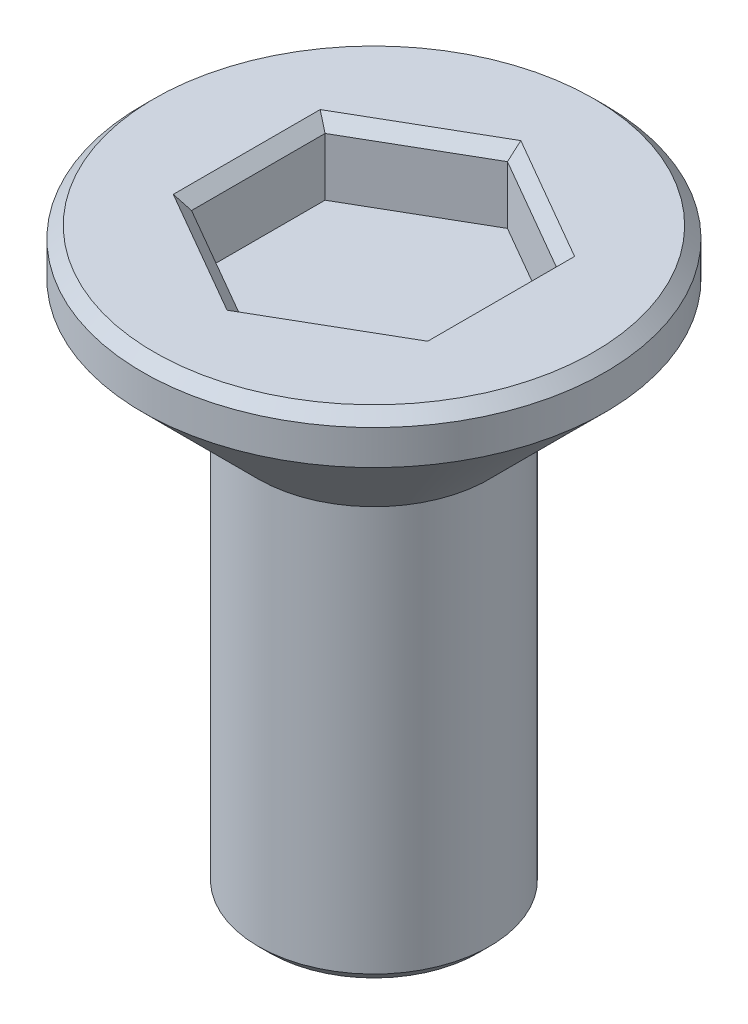
ISO-10303-21;
HEADER;
FILE_DESCRIPTION(('STEP AP214'),'2;1');
FILE_NAME('part.step','',(''),(''),'','','');
FILE_SCHEMA(('AUTOMOTIVE_DESIGN { 1 0 10303 214 1 1 1 1 }'));
ENDSEC;
DATA;
#1=APPLICATION_CONTEXT('core data for automotive mechanical design processes');
#2=APPLICATION_PROTOCOL_DEFINITION('international standard','automotive_design',2000,#1);
#3=PRODUCT_CONTEXT('',#1,'mechanical');
#4=PRODUCT('Part','Part','',(#3));
#5=PRODUCT_RELATED_PRODUCT_CATEGORY('part','',(#4));
#6=PRODUCT_DEFINITION_FORMATION('','',#4);
#7=PRODUCT_DEFINITION_CONTEXT('part definition',#1,'design');
#8=PRODUCT_DEFINITION('design','',#6,#7);
#9=PRODUCT_DEFINITION_SHAPE('','',#8);
#10=(LENGTH_UNIT() NAMED_UNIT(*) SI_UNIT(.MILLI.,.METRE.));
#11=(NAMED_UNIT(*) PLANE_ANGLE_UNIT() SI_UNIT($,.RADIAN.));
#12=(NAMED_UNIT(*) SI_UNIT($,.STERADIAN.) SOLID_ANGLE_UNIT());
#13=UNCERTAINTY_MEASURE_WITH_UNIT(LENGTH_MEASURE(1.E-05),#10,'distance_accuracy_value','');
#14=(GEOMETRIC_REPRESENTATION_CONTEXT(3) GLOBAL_UNCERTAINTY_ASSIGNED_CONTEXT((#13)) GLOBAL_UNIT_ASSIGNED_CONTEXT((#10,
#11,#12)) REPRESENTATION_CONTEXT('',''));
#15=CARTESIAN_POINT('',(0.,0.,0.));
#16=DIRECTION('',(0.,0.,1.));
#17=DIRECTION('',(1.,0.,0.));
#18=AXIS2_PLACEMENT_3D('',#15,#16,#17);
#19=CARTESIAN_POINT('',(0.,5.,0.));
#20=DIRECTION('',(0.,-1.,0.));
#21=DIRECTION('',(0.,0.,-1.));
#22=AXIS2_PLACEMENT_3D('',#19,#20,#21);
#23=PLANE('',#22);
#24=DIRECTION('',(-0.866025403784439,0.,0.5));
#25=VECTOR('',#24,1.);
#26=CARTESIAN_POINT('',(0.55,5.,0.952627944162882));
#27=LINE('',#26,#25);
#28=CARTESIAN_POINT('',(1.1,5.,0.635085296108588));
#29=VERTEX_POINT('',#28);
#30=CARTESIAN_POINT('',(0.,5.,1.27017059221718));
#31=VERTEX_POINT('',#30);
#32=EDGE_CURVE('E182',#29,#31,#27,.T.);
#33=ORIENTED_EDGE('',*,*,#32,.T.);
#34=DIRECTION('',(-0.866025403784439,0.,-0.5));
#35=VECTOR('',#34,1.);
#36=CARTESIAN_POINT('',(-0.55,5.,0.952627944162883));
#37=LINE('',#36,#35);
#38=CARTESIAN_POINT('',(-1.1,5.,0.635085296108589));
#39=VERTEX_POINT('',#38);
#40=EDGE_CURVE('E184',#31,#39,#37,.T.);
#41=ORIENTED_EDGE('',*,*,#40,.T.);
#42=DIRECTION('',(0.,0.,-1.));
#43=VECTOR('',#42,1.);
#44=CARTESIAN_POINT('',(-1.1,5.,0.));
#45=LINE('',#44,#43);
#46=CARTESIAN_POINT('',(-1.1,5.,-0.635085296108589));
#47=VERTEX_POINT('',#46);
#48=EDGE_CURVE('E174',#39,#47,#45,.T.);
#49=ORIENTED_EDGE('',*,*,#48,.T.);
#50=DIRECTION('',(0.866025403784439,0.,-0.5));
#51=VECTOR('',#50,1.);
#52=CARTESIAN_POINT('',(-0.55,5.,-0.952627944162883));
#53=LINE('',#52,#51);
#54=CARTESIAN_POINT('',(0.,5.,-1.27017059221718));
#55=VERTEX_POINT('',#54);
#56=EDGE_CURVE('E176',#47,#55,#53,.T.);
#57=ORIENTED_EDGE('',*,*,#56,.T.);
#58=DIRECTION('',(0.866025403784439,0.,0.5));
#59=VECTOR('',#58,1.);
#60=CARTESIAN_POINT('',(0.550000000000001,5.,-0.952627944162883));
#61=LINE('',#60,#59);
#62=CARTESIAN_POINT('',(1.1,5.,-0.635085296108589));
#63=VERTEX_POINT('',#62);
#64=EDGE_CURVE('E178',#55,#63,#61,.T.);
#65=ORIENTED_EDGE('',*,*,#64,.T.);
#66=DIRECTION('',(0.,0.,1.));
#67=VECTOR('',#66,1.);
#68=CARTESIAN_POINT('',(1.1,5.,0.));
#69=LINE('',#68,#67);
#70=EDGE_CURVE('E180',#63,#29,#69,.T.);
#71=ORIENTED_EDGE('',*,*,#70,.T.);
#72=EDGE_LOOP('',(#33,#41,#49,#57,#65,#71));
#73=FACE_BOUND('',#72,.T.);
#74=CARTESIAN_POINT('',(0.,5.,0.));
#75=DIRECTION('',(0.,-1.,0.));
#76=DIRECTION('',(0.,0.,-1.));
#77=AXIS2_PLACEMENT_3D('',#74,#75,#76);
#78=CIRCLE('',#77,1.9);
#79=CARTESIAN_POINT('',(0.,5.,-1.9));
#80=VERTEX_POINT('',#79);
#81=EDGE_CURVE('E171',#80,#80,#78,.F.);
#82=ORIENTED_EDGE('',*,*,#81,.T.);
#83=EDGE_LOOP('',(#82));
#84=FACE_BOUND('',#83,.T.);
#85=ADVANCED_FACE('F37',(#73,#84),#23,.F.);
#86=CARTESIAN_POINT('',(0.,0.,0.));
#87=DIRECTION('',(0.,-1.,0.));
#88=DIRECTION('',(0.,0.,-1.));
#89=AXIS2_PLACEMENT_3D('',#86,#87,#88);
#90=CYLINDRICAL_SURFACE('',#89,2.);
#91=CARTESIAN_POINT('',(0.,4.9,0.));
#92=DIRECTION('',(0.,-1.,0.));
#93=DIRECTION('',(0.,0.,-1.));
#94=AXIS2_PLACEMENT_3D('',#91,#92,#93);
#95=CIRCLE('',#94,2.);
#96=CARTESIAN_POINT('',(0.,4.9,-2.));
#97=VERTEX_POINT('',#96);
#98=EDGE_CURVE('E11',#97,#97,#95,.T.);
#99=ORIENTED_EDGE('',*,*,#98,.T.);
#100=EDGE_LOOP('',(#99));
#101=FACE_BOUND('',#100,.T.);
#102=CARTESIAN_POINT('',(0.,4.59999999999999,0.));
#103=DIRECTION('',(0.,-1.,0.));
#104=DIRECTION('',(0.,0.,-1.));
#105=AXIS2_PLACEMENT_3D('',#102,#103,#104);
#106=CIRCLE('',#105,2.);
#107=CARTESIAN_POINT('',(0.,4.59999999999999,-2.));
#108=VERTEX_POINT('',#107);
#109=EDGE_CURVE('E161',#108,#108,#106,.T.);
#110=ORIENTED_EDGE('',*,*,#109,.F.);
#111=EDGE_LOOP('',(#110));
#112=FACE_BOUND('',#111,.T.);
#113=ADVANCED_FACE('F240',(#101,#112),#90,.T.);
#114=CARTESIAN_POINT('',(0.,4.59999999999999,0.));
#115=DIRECTION('',(0.,1.,0.));
#116=DIRECTION('',(0.,0.,1.));
#117=AXIS2_PLACEMENT_3D('',#114,#115,#116);
#118=CONICAL_SURFACE('',#117,2.,0.785398163397454);
#119=CARTESIAN_POINT('',(0.,3.6,0.));
#120=DIRECTION('',(0.,-1.,0.));
#121=DIRECTION('',(0.,0.,-1.));
#122=AXIS2_PLACEMENT_3D('',#119,#120,#121);
#123=CIRCLE('',#122,1.);
#124=CARTESIAN_POINT('',(0.,3.6,-1.));
#125=VERTEX_POINT('',#124);
#126=EDGE_CURVE('E151',#125,#125,#123,.T.);
#127=ORIENTED_EDGE('',*,*,#126,.F.);
#128=EDGE_LOOP('',(#127));
#129=FACE_BOUND('',#128,.T.);
#130=ORIENTED_EDGE('',*,*,#109,.T.);
#131=EDGE_LOOP('',(#130));
#132=FACE_BOUND('',#131,.T.);
#133=ADVANCED_FACE('F247',(#129,#132),#118,.T.);
#134=CARTESIAN_POINT('',(0.,0.,0.));
#135=DIRECTION('',(0.,-1.,0.));
#136=DIRECTION('',(0.,0.,-1.));
#137=AXIS2_PLACEMENT_3D('',#134,#135,#136);
#138=CYLINDRICAL_SURFACE('',#137,1.);
#139=CARTESIAN_POINT('',(0.,0.100000000000002,0.));
#140=DIRECTION('',(0.,1.,0.));
#141=DIRECTION('',(0.,0.,1.));
#142=AXIS2_PLACEMENT_3D('',#139,#140,#141);
#143=CIRCLE('',#142,1.);
#144=CARTESIAN_POINT('',(0.,0.100000000000002,1.));
#145=VERTEX_POINT('',#144);
#146=EDGE_CURVE('E167',#145,#145,#143,.T.);
#147=ORIENTED_EDGE('',*,*,#146,.T.);
#148=EDGE_LOOP('',(#147));
#149=FACE_BOUND('',#148,.T.);
#150=ORIENTED_EDGE('',*,*,#126,.T.);
#151=EDGE_LOOP('',(#150));
#152=FACE_BOUND('',#151,.T.);
#153=ADVANCED_FACE('F392',(#149,#152),#138,.T.);
#154=CARTESIAN_POINT('',(0.,0.,1.));
#155=DIRECTION('',(0.,1.,0.));
#156=DIRECTION('',(0.,0.,1.));
#157=AXIS2_PLACEMENT_3D('',#154,#155,#156);
#158=PLANE('',#157);
#159=CARTESIAN_POINT('',(0.,0.,0.));
#160=DIRECTION('',(0.,1.,0.));
#161=DIRECTION('',(0.,0.,1.));
#162=AXIS2_PLACEMENT_3D('',#159,#160,#161);
#163=CIRCLE('',#162,0.899999999999999);
#164=CARTESIAN_POINT('',(0.,0.,0.899999999999999));
#165=VERTEX_POINT('',#164);
#166=EDGE_CURVE('E164',#165,#165,#163,.F.);
#167=ORIENTED_EDGE('',*,*,#166,.T.);
#168=EDGE_LOOP('',(#167));
#169=FACE_BOUND('',#168,.T.);
#170=ADVANCED_FACE('F385',(#169),#158,.F.);
#171=CARTESIAN_POINT('',(-1.,4.4,0.577350269189626));
#172=DIRECTION('',(-0.5,0.,0.866025403784439));
#173=DIRECTION('',(0.866025403784439,0.,0.5));
#174=AXIS2_PLACEMENT_3D('',#171,#172,#173);
#175=PLANE('',#174);
#176=DIRECTION('',(0.,1.,0.));
#177=VECTOR('',#176,1.);
#178=CARTESIAN_POINT('',(-1.,4.4,0.577350269189626));
#179=LINE('',#178,#177);
#180=CARTESIAN_POINT('',(-1.,4.4,0.577350269189626));
#181=VERTEX_POINT('',#180);
#182=CARTESIAN_POINT('',(-1.,4.9,0.577350269189626));
#183=VERTEX_POINT('',#182);
#184=EDGE_CURVE('E149',#181,#183,#179,.T.);
#185=ORIENTED_EDGE('',*,*,#184,.T.);
#186=DIRECTION('',(0.866025403784439,0.,0.5));
#187=VECTOR('',#186,1.);
#188=CARTESIAN_POINT('',(-1.,4.9,0.577350269189626));
#189=LINE('',#188,#187);
#190=CARTESIAN_POINT('',(0.,4.9,1.15470053837925));
#191=VERTEX_POINT('',#190);
#192=EDGE_CURVE('E121',#183,#191,#189,.T.);
#193=ORIENTED_EDGE('',*,*,#192,.T.);
#194=DIRECTION('',(0.,1.,0.));
#195=VECTOR('',#194,1.);
#196=CARTESIAN_POINT('',(0.,4.4,1.15470053837925));
#197=LINE('',#196,#195);
#198=CARTESIAN_POINT('',(0.,4.4,1.15470053837925));
#199=VERTEX_POINT('',#198);
#200=EDGE_CURVE('E113',#199,#191,#197,.T.);
#201=ORIENTED_EDGE('',*,*,#200,.F.);
#202=DIRECTION('',(0.866025403784438,0.,0.5));
#203=VECTOR('',#202,1.);
#204=CARTESIAN_POINT('',(-1.,4.4,0.577350269189626));
#205=LINE('',#204,#203);
#206=EDGE_CURVE('E118',#181,#199,#205,.T.);
#207=ORIENTED_EDGE('',*,*,#206,.F.);
#208=EDGE_LOOP('',(#185,#193,#201,#207));
#209=FACE_BOUND('',#208,.T.);
#210=ADVANCED_FACE('F116',(#209),#175,.F.);
#211=CARTESIAN_POINT('',(-1.,4.4,-0.577350269189626));
#212=DIRECTION('',(-1.,0.,0.));
#213=DIRECTION('',(0.,0.,1.));
#214=AXIS2_PLACEMENT_3D('',#211,#212,#213);
#215=PLANE('',#214);
#216=DIRECTION('',(0.,1.,0.));
#217=VECTOR('',#216,1.);
#218=CARTESIAN_POINT('',(-1.,4.4,-0.577350269189626));
#219=LINE('',#218,#217);
#220=CARTESIAN_POINT('',(-1.,4.4,-0.577350269189626));
#221=VERTEX_POINT('',#220);
#222=CARTESIAN_POINT('',(-1.,4.9,-0.577350269189626));
#223=VERTEX_POINT('',#222);
#224=EDGE_CURVE('E152',#221,#223,#219,.T.);
#225=ORIENTED_EDGE('',*,*,#224,.T.);
#226=DIRECTION('',(0.,0.,1.));
#227=VECTOR('',#226,1.);
#228=CARTESIAN_POINT('',(-1.,4.9,-0.577350269189626));
#229=LINE('',#228,#227);
#230=EDGE_CURVE('E47',#223,#183,#229,.T.);
#231=ORIENTED_EDGE('',*,*,#230,.T.);
#232=ORIENTED_EDGE('',*,*,#184,.F.);
#233=DIRECTION('',(0.,0.,1.));
#234=VECTOR('',#233,1.);
#235=CARTESIAN_POINT('',(-1.,4.4,-0.577350269189626));
#236=LINE('',#235,#234);
#237=EDGE_CURVE('E124',#221,#181,#236,.T.);
#238=ORIENTED_EDGE('',*,*,#237,.F.);
#239=EDGE_LOOP('',(#225,#231,#232,#238));
#240=FACE_BOUND('',#239,.T.);
#241=ADVANCED_FACE('F224',(#240),#215,.F.);
#242=CARTESIAN_POINT('',(0.,4.4,-1.15470053837925));
#243=DIRECTION('',(-0.5,0.,-0.866025403784438));
#244=DIRECTION('',(-0.866025403784438,0.,0.5));
#245=AXIS2_PLACEMENT_3D('',#242,#243,#244);
#246=PLANE('',#245);
#247=DIRECTION('',(0.,1.,0.));
#248=VECTOR('',#247,1.);
#249=CARTESIAN_POINT('',(0.,4.4,-1.15470053837925));
#250=LINE('',#249,#248);
#251=CARTESIAN_POINT('',(0.,4.4,-1.15470053837925));
#252=VERTEX_POINT('',#251);
#253=CARTESIAN_POINT('',(0.,4.9,-1.15470053837925));
#254=VERTEX_POINT('',#253);
#255=EDGE_CURVE('E154',#252,#254,#250,.T.);
#256=ORIENTED_EDGE('',*,*,#255,.T.);
#257=DIRECTION('',(-0.866025403784438,0.,0.5));
#258=VECTOR('',#257,1.);
#259=CARTESIAN_POINT('',(0.,4.9,-1.15470053837925));
#260=LINE('',#259,#258);
#261=EDGE_CURVE('E55',#254,#223,#260,.T.);
#262=ORIENTED_EDGE('',*,*,#261,.T.);
#263=ORIENTED_EDGE('',*,*,#224,.F.);
#264=DIRECTION('',(-0.866025403784439,0.,0.5));
#265=VECTOR('',#264,1.);
#266=CARTESIAN_POINT('',(0.,4.4,-1.15470053837925));
#267=LINE('',#266,#265);
#268=EDGE_CURVE('E146',#252,#221,#267,.T.);
#269=ORIENTED_EDGE('',*,*,#268,.F.);
#270=EDGE_LOOP('',(#256,#262,#263,#269));
#271=FACE_BOUND('',#270,.T.);
#272=ADVANCED_FACE('F226',(#271),#246,.F.);
#273=CARTESIAN_POINT('',(1.,4.4,-0.577350269189626));
#274=DIRECTION('',(0.5,0.,-0.866025403784439));
#275=DIRECTION('',(-0.866025403784439,0.,-0.5));
#276=AXIS2_PLACEMENT_3D('',#273,#274,#275);
#277=PLANE('',#276);
#278=DIRECTION('',(0.,1.,0.));
#279=VECTOR('',#278,1.);
#280=CARTESIAN_POINT('',(1.,4.4,-0.577350269189626));
#281=LINE('',#280,#279);
#282=CARTESIAN_POINT('',(1.,4.4,-0.577350269189626));
#283=VERTEX_POINT('',#282);
#284=CARTESIAN_POINT('',(1.,4.9,-0.577350269189626));
#285=VERTEX_POINT('',#284);
#286=EDGE_CURVE('E156',#283,#285,#281,.T.);
#287=ORIENTED_EDGE('',*,*,#286,.T.);
#288=DIRECTION('',(-0.866025403784439,0.,-0.5));
#289=VECTOR('',#288,1.);
#290=CARTESIAN_POINT('',(1.,4.9,-0.577350269189626));
#291=LINE('',#290,#289);
#292=EDGE_CURVE('E63',#285,#254,#291,.T.);
#293=ORIENTED_EDGE('',*,*,#292,.T.);
#294=ORIENTED_EDGE('',*,*,#255,.F.);
#295=DIRECTION('',(-0.866025403784438,0.,-0.5));
#296=VECTOR('',#295,1.);
#297=CARTESIAN_POINT('',(1.,4.4,-0.577350269189626));
#298=LINE('',#297,#296);
#299=EDGE_CURVE('E143',#283,#252,#298,.T.);
#300=ORIENTED_EDGE('',*,*,#299,.F.);
#301=EDGE_LOOP('',(#287,#293,#294,#300));
#302=FACE_BOUND('',#301,.T.);
#303=ADVANCED_FACE('F228',(#302),#277,.F.);
#304=CARTESIAN_POINT('',(1.,4.4,0.577350269189626));
#305=DIRECTION('',(1.,0.,0.));
#306=DIRECTION('',(0.,0.,-1.));
#307=AXIS2_PLACEMENT_3D('',#304,#305,#306);
#308=PLANE('',#307);
#309=DIRECTION('',(0.,1.,0.));
#310=VECTOR('',#309,1.);
#311=CARTESIAN_POINT('',(1.,4.4,0.577350269189626));
#312=LINE('',#311,#310);
#313=CARTESIAN_POINT('',(1.,4.4,0.577350269189626));
#314=VERTEX_POINT('',#313);
#315=CARTESIAN_POINT('',(1.,4.9,0.577350269189626));
#316=VERTEX_POINT('',#315);
#317=EDGE_CURVE('E123',#314,#316,#312,.T.);
#318=ORIENTED_EDGE('',*,*,#317,.T.);
#319=DIRECTION('',(0.,0.,-1.));
#320=VECTOR('',#319,1.);
#321=CARTESIAN_POINT('',(1.,4.9,0.577350269189626));
#322=LINE('',#321,#320);
#323=EDGE_CURVE('E189',#316,#285,#322,.T.);
#324=ORIENTED_EDGE('',*,*,#323,.T.);
#325=ORIENTED_EDGE('',*,*,#286,.F.);
#326=DIRECTION('',(0.,0.,-1.));
#327=VECTOR('',#326,1.);
#328=CARTESIAN_POINT('',(1.,4.4,0.577350269189626));
#329=LINE('',#328,#327);
#330=EDGE_CURVE('E133',#314,#283,#329,.T.);
#331=ORIENTED_EDGE('',*,*,#330,.F.);
#332=EDGE_LOOP('',(#318,#324,#325,#331));
#333=FACE_BOUND('',#332,.T.);
#334=ADVANCED_FACE('F230',(#333),#308,.F.);
#335=CARTESIAN_POINT('',(0.,4.4,1.15470053837925));
#336=DIRECTION('',(0.5,0.,0.866025403784438));
#337=DIRECTION('',(0.866025403784438,0.,-0.5));
#338=AXIS2_PLACEMENT_3D('',#335,#336,#337);
#339=PLANE('',#338);
#340=ORIENTED_EDGE('',*,*,#200,.T.);
#341=DIRECTION('',(0.866025403784438,0.,-0.5));
#342=VECTOR('',#341,1.);
#343=CARTESIAN_POINT('',(0.,4.9,1.15470053837925));
#344=LINE('',#343,#342);
#345=EDGE_CURVE('E187',#191,#316,#344,.T.);
#346=ORIENTED_EDGE('',*,*,#345,.T.);
#347=ORIENTED_EDGE('',*,*,#317,.F.);
#348=DIRECTION('',(0.866025403784439,0.,-0.5));
#349=VECTOR('',#348,1.);
#350=CARTESIAN_POINT('',(0.,4.4,1.15470053837925));
#351=LINE('',#350,#349);
#352=EDGE_CURVE('E127',#199,#314,#351,.T.);
#353=ORIENTED_EDGE('',*,*,#352,.F.);
#354=EDGE_LOOP('',(#340,#346,#347,#353));
#355=FACE_BOUND('',#354,.T.);
#356=ADVANCED_FACE('F128',(#355),#339,.F.);
#357=CARTESIAN_POINT('',(0.,4.4,0.));
#358=DIRECTION('',(0.,1.,0.));
#359=DIRECTION('',(0.,0.,1.));
#360=AXIS2_PLACEMENT_3D('',#357,#358,#359);
#361=PLANE('',#360);
#362=ORIENTED_EDGE('',*,*,#206,.T.);
#363=ORIENTED_EDGE('',*,*,#352,.T.);
#364=ORIENTED_EDGE('',*,*,#330,.T.);
#365=ORIENTED_EDGE('',*,*,#299,.T.);
#366=ORIENTED_EDGE('',*,*,#268,.T.);
#367=ORIENTED_EDGE('',*,*,#237,.T.);
#368=EDGE_LOOP('',(#362,#363,#364,#365,#366,#367));
#369=FACE_BOUND('',#368,.T.);
#370=ADVANCED_FACE('F135',(#369),#361,.T.);
#371=CARTESIAN_POINT('',(0.,0.,0.));
#372=DIRECTION('',(0.,1.,0.));
#373=DIRECTION('',(0.,0.,1.));
#374=AXIS2_PLACEMENT_3D('',#371,#372,#373);
#375=CONICAL_SURFACE('',#374,0.899999999999999,0.785398163397444);
#376=ORIENTED_EDGE('',*,*,#146,.F.);
#377=EDGE_LOOP('',(#376));
#378=FACE_BOUND('',#377,.T.);
#379=ORIENTED_EDGE('',*,*,#166,.F.);
#380=EDGE_LOOP('',(#379));
#381=FACE_BOUND('',#380,.T.);
#382=ADVANCED_FACE('F254',(#378,#381),#375,.T.);
#383=CARTESIAN_POINT('',(1.,4.9,-0.577350269189626));
#384=DIRECTION('',(0.353553390593275,-0.707106781186545,-0.612372435695797));
#385=DIRECTION('',(-0.866025403784439,0.,-0.5));
#386=AXIS2_PLACEMENT_3D('',#383,#384,#385);
#387=PLANE('',#386);
#388=DIRECTION('',(0.654653670707975,0.65465367070798,-0.377964473009226));
#389=VECTOR('',#388,1.);
#390=CARTESIAN_POINT('',(0.714285714285716,4.61428571428571,-0.412393049421162));
#391=LINE('',#390,#389);
#392=EDGE_CURVE('E140',#63,#285,#391,.F.);
#393=ORIENTED_EDGE('',*,*,#392,.F.);
#394=ORIENTED_EDGE('',*,*,#64,.F.);
#395=DIRECTION('',(0.,0.65465367070798,-0.755928946018452));
#396=VECTOR('',#395,1.);
#397=CARTESIAN_POINT('',(0.,4.61428571428571,-0.824786098842325));
#398=LINE('',#397,#396);
#399=EDGE_CURVE('E42',#254,#55,#398,.T.);
#400=ORIENTED_EDGE('',*,*,#399,.F.);
#401=ORIENTED_EDGE('',*,*,#292,.F.);
#402=EDGE_LOOP('',(#393,#394,#400,#401));
#403=FACE_BOUND('',#402,.T.);
#404=ADVANCED_FACE('F212',(#403),#387,.F.);
#405=CARTESIAN_POINT('',(0.,4.9,-1.15470053837925));
#406=DIRECTION('',(-0.353553390593275,-0.707106781186545,-0.612372435695797));
#407=DIRECTION('',(-0.866025403784438,0.,0.5));
#408=AXIS2_PLACEMENT_3D('',#405,#406,#407);
#409=PLANE('',#408);
#410=ORIENTED_EDGE('',*,*,#399,.T.);
#411=ORIENTED_EDGE('',*,*,#56,.F.);
#412=DIRECTION('',(-0.654653670707974,0.65465367070798,-0.377964473009226));
#413=VECTOR('',#412,1.);
#414=CARTESIAN_POINT('',(-0.714285714285717,4.61428571428571,-0.412393049421162));
#415=LINE('',#414,#413);
#416=EDGE_CURVE('E201',#223,#47,#415,.T.);
#417=ORIENTED_EDGE('',*,*,#416,.F.);
#418=ORIENTED_EDGE('',*,*,#261,.F.);
#419=EDGE_LOOP('',(#410,#411,#417,#418));
#420=FACE_BOUND('',#419,.T.);
#421=ADVANCED_FACE('F217',(#420),#409,.F.);
#422=CARTESIAN_POINT('',(1.,4.9,0.577350269189626));
#423=DIRECTION('',(0.707106781186551,-0.707106781186544,0.));
#424=DIRECTION('',(0.,0.,-1.));
#425=AXIS2_PLACEMENT_3D('',#422,#423,#424);
#426=PLANE('',#425);
#427=ORIENTED_EDGE('',*,*,#392,.T.);
#428=ORIENTED_EDGE('',*,*,#323,.F.);
#429=DIRECTION('',(0.654653670707975,0.65465367070798,0.377964473009226));
#430=VECTOR('',#429,1.);
#431=CARTESIAN_POINT('',(0.714285714285716,4.61428571428571,0.412393049421162));
#432=LINE('',#431,#430);
#433=EDGE_CURVE('E198',#29,#316,#432,.F.);
#434=ORIENTED_EDGE('',*,*,#433,.F.);
#435=ORIENTED_EDGE('',*,*,#70,.F.);
#436=EDGE_LOOP('',(#427,#428,#434,#435));
#437=FACE_BOUND('',#436,.T.);
#438=ADVANCED_FACE('F208',(#437),#426,.F.);
#439=CARTESIAN_POINT('',(-1.,4.9,-0.577350269189626));
#440=DIRECTION('',(-0.707106781186551,-0.707106781186544,0.));
#441=DIRECTION('',(0.,0.,1.));
#442=AXIS2_PLACEMENT_3D('',#439,#440,#441);
#443=PLANE('',#442);
#444=ORIENTED_EDGE('',*,*,#416,.T.);
#445=ORIENTED_EDGE('',*,*,#48,.F.);
#446=DIRECTION('',(0.654653670707975,-0.654653670707981,-0.377964473009225));
#447=VECTOR('',#446,1.);
#448=CARTESIAN_POINT('',(-1.,4.9,0.577350269189626));
#449=LINE('',#448,#447);
#450=EDGE_CURVE('E196',#183,#39,#449,.F.);
#451=ORIENTED_EDGE('',*,*,#450,.F.);
#452=ORIENTED_EDGE('',*,*,#230,.F.);
#453=EDGE_LOOP('',(#444,#445,#451,#452));
#454=FACE_BOUND('',#453,.T.);
#455=ADVANCED_FACE('F222',(#454),#443,.F.);
#456=CARTESIAN_POINT('',(0.,4.9,1.15470053837925));
#457=DIRECTION('',(0.353553390593275,-0.707106781186545,0.612372435695797));
#458=DIRECTION('',(0.866025403784438,0.,-0.5));
#459=AXIS2_PLACEMENT_3D('',#456,#457,#458);
#460=PLANE('',#459);
#461=ORIENTED_EDGE('',*,*,#433,.T.);
#462=ORIENTED_EDGE('',*,*,#345,.F.);
#463=DIRECTION('',(0.,0.65465367070798,0.755928946018452));
#464=VECTOR('',#463,1.);
#465=CARTESIAN_POINT('',(0.,4.61428571428571,0.824786098842324));
#466=LINE('',#465,#464);
#467=EDGE_CURVE('E194',#31,#191,#466,.F.);
#468=ORIENTED_EDGE('',*,*,#467,.F.);
#469=ORIENTED_EDGE('',*,*,#32,.F.);
#470=EDGE_LOOP('',(#461,#462,#468,#469));
#471=FACE_BOUND('',#470,.T.);
#472=ADVANCED_FACE('F268',(#471),#460,.F.);
#473=CARTESIAN_POINT('',(-1.,4.9,0.577350269189626));
#474=DIRECTION('',(-0.353553390593275,-0.707106781186544,0.612372435695797));
#475=DIRECTION('',(0.866025403784439,0.,0.5));
#476=AXIS2_PLACEMENT_3D('',#473,#474,#475);
#477=PLANE('',#476);
#478=ORIENTED_EDGE('',*,*,#450,.T.);
#479=ORIENTED_EDGE('',*,*,#40,.F.);
#480=ORIENTED_EDGE('',*,*,#467,.T.);
#481=ORIENTED_EDGE('',*,*,#192,.F.);
#482=EDGE_LOOP('',(#478,#479,#480,#481));
#483=FACE_BOUND('',#482,.T.);
#484=ADVANCED_FACE('F262',(#483),#477,.F.);
#485=CARTESIAN_POINT('',(0.,4.9,0.));
#486=DIRECTION('',(0.,-1.,0.));
#487=DIRECTION('',(0.,0.,-1.));
#488=AXIS2_PLACEMENT_3D('',#485,#486,#487);
#489=CONICAL_SURFACE('',#488,2.,0.785398163397446);
#490=ORIENTED_EDGE('',*,*,#81,.F.);
#491=EDGE_LOOP('',(#490));
#492=FACE_BOUND('',#491,.T.);
#493=ORIENTED_EDGE('',*,*,#98,.F.);
#494=EDGE_LOOP('',(#493));
#495=FACE_BOUND('',#494,.T.);
#496=ADVANCED_FACE('F40',(#492,#495),#489,.T.);
#497=CLOSED_SHELL('',(#85,#113,#133,#153,#170,#210,#241,#272,#303,#334,#356,#370,#382,#404,#421,
#438,#455,#472,#484,#496));
#498=MANIFOLD_SOLID_BREP('B2',#497);
#499=ADVANCED_BREP_SHAPE_REPRESENTATION('',(#18,#498),#14);
#500=SHAPE_DEFINITION_REPRESENTATION(#9,#499);
ENDSEC;
END-ISO-10303-21;
